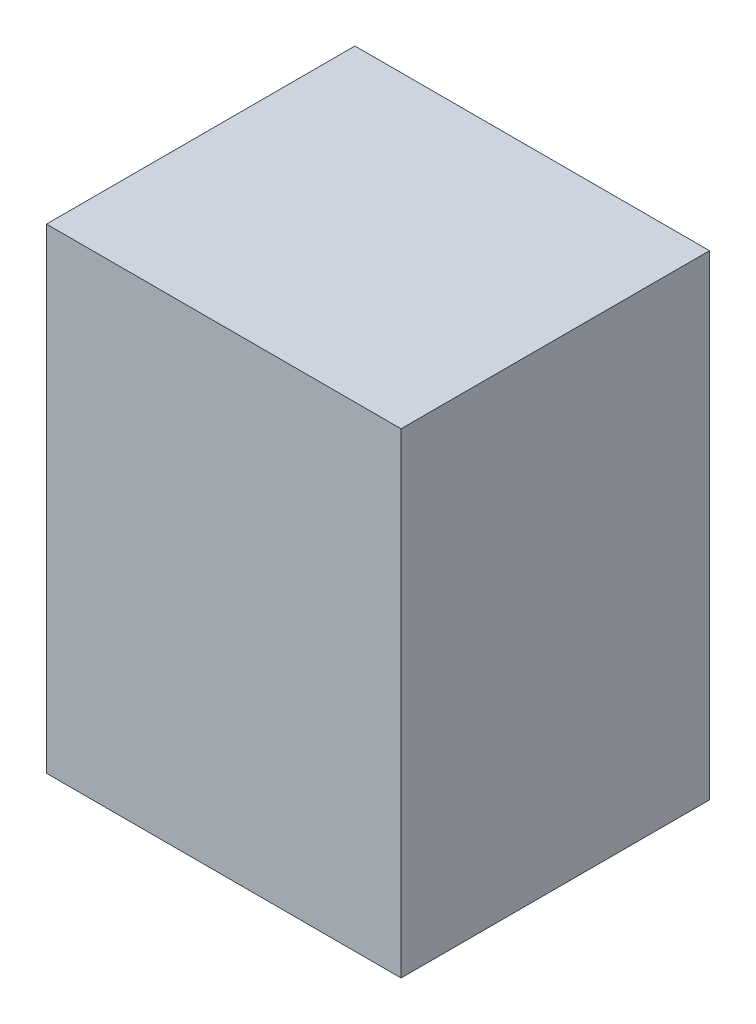
ISO-10303-21;
HEADER;
FILE_DESCRIPTION(('STEP AP214'),'2;1');
FILE_NAME('part.step','',(''),(''),'','','');
FILE_SCHEMA(('AUTOMOTIVE_DESIGN { 1 0 10303 214 1 1 1 1 }'));
ENDSEC;
DATA;
#1=APPLICATION_CONTEXT('core data for automotive mechanical design processes');
#2=APPLICATION_PROTOCOL_DEFINITION('international standard','automotive_design',2000,#1);
#3=PRODUCT_CONTEXT('',#1,'mechanical');
#4=PRODUCT('Part','Part','',(#3));
#5=PRODUCT_RELATED_PRODUCT_CATEGORY('part','',(#4));
#6=PRODUCT_DEFINITION_FORMATION('','',#4);
#7=PRODUCT_DEFINITION_CONTEXT('part definition',#1,'design');
#8=PRODUCT_DEFINITION('design','',#6,#7);
#9=PRODUCT_DEFINITION_SHAPE('','',#8);
#10=(LENGTH_UNIT() NAMED_UNIT(*) SI_UNIT(.MILLI.,.METRE.));
#11=(NAMED_UNIT(*) PLANE_ANGLE_UNIT() SI_UNIT($,.RADIAN.));
#12=(NAMED_UNIT(*) SI_UNIT($,.STERADIAN.) SOLID_ANGLE_UNIT());
#13=UNCERTAINTY_MEASURE_WITH_UNIT(LENGTH_MEASURE(1.E-05),#10,'distance_accuracy_value','');
#14=(GEOMETRIC_REPRESENTATION_CONTEXT(3) GLOBAL_UNCERTAINTY_ASSIGNED_CONTEXT((#13)) GLOBAL_UNIT_ASSIGNED_CONTEXT((#10,
#11,#12)) REPRESENTATION_CONTEXT('',''));
#15=CARTESIAN_POINT('',(0.,0.,0.));
#16=DIRECTION('',(0.,0.,1.));
#17=DIRECTION('',(1.,0.,0.));
#18=AXIS2_PLACEMENT_3D('',#15,#16,#17);
#19=CARTESIAN_POINT('',(-7.8105,-10.4775,13.589));
#20=DIRECTION('',(0.,0.,1.));
#21=DIRECTION('',(1.,0.,0.));
#22=AXIS2_PLACEMENT_3D('',#19,#20,#21);
#23=PLANE('',#22);
#24=DIRECTION('',(1.,0.,0.));
#25=VECTOR('',#24,1.);
#26=CARTESIAN_POINT('',(-7.8105,10.4775,13.589));
#27=LINE('',#26,#25);
#28=CARTESIAN_POINT('',(-7.8105,10.4775,13.589));
#29=VERTEX_POINT('',#28);
#30=CARTESIAN_POINT('',(7.8105,10.4775,13.589));
#31=VERTEX_POINT('',#30);
#32=EDGE_CURVE('E53',#29,#31,#27,.T.);
#33=ORIENTED_EDGE('',*,*,#32,.F.);
#34=DIRECTION('',(0.,1.,0.));
#35=VECTOR('',#34,1.);
#36=CARTESIAN_POINT('',(-7.8105,-10.4775,13.589));
#37=LINE('',#36,#35);
#38=CARTESIAN_POINT('',(-7.8105,-10.4775,13.589));
#39=VERTEX_POINT('',#38);
#40=EDGE_CURVE('E68',#39,#29,#37,.T.);
#41=ORIENTED_EDGE('',*,*,#40,.F.);
#42=DIRECTION('',(1.,0.,0.));
#43=VECTOR('',#42,1.);
#44=CARTESIAN_POINT('',(7.8105,-10.4775,13.589));
#45=LINE('',#44,#43);
#46=CARTESIAN_POINT('',(7.8105,-10.4775,13.589));
#47=VERTEX_POINT('',#46);
#48=EDGE_CURVE('E20',#47,#39,#45,.F.);
#49=ORIENTED_EDGE('',*,*,#48,.F.);
#50=DIRECTION('',(0.,1.,0.));
#51=VECTOR('',#50,1.);
#52=CARTESIAN_POINT('',(7.8105,10.4775,13.589));
#53=LINE('',#52,#51);
#54=EDGE_CURVE('E58',#31,#47,#53,.F.);
#55=ORIENTED_EDGE('',*,*,#54,.F.);
#56=EDGE_LOOP('',(#33,#41,#49,#55));
#57=FACE_BOUND('',#56,.T.);
#58=ADVANCED_FACE('F17',(#57),#23,.T.);
#59=CARTESIAN_POINT('',(7.8105,-10.4775,0.));
#60=DIRECTION('',(0.,-1.,0.));
#61=DIRECTION('',(0.,0.,-1.));
#62=AXIS2_PLACEMENT_3D('',#59,#60,#61);
#63=PLANE('',#62);
#64=DIRECTION('',(0.,0.,1.));
#65=VECTOR('',#64,1.);
#66=CARTESIAN_POINT('',(-7.8105,-10.4775,0.));
#67=LINE('',#66,#65);
#68=CARTESIAN_POINT('',(-7.8105,-10.4775,0.));
#69=VERTEX_POINT('',#68);
#70=EDGE_CURVE('E79',#69,#39,#67,.T.);
#71=ORIENTED_EDGE('',*,*,#70,.F.);
#72=DIRECTION('',(1.,0.,0.));
#73=VECTOR('',#72,1.);
#74=CARTESIAN_POINT('',(-7.8105,-10.4775,0.));
#75=LINE('',#74,#73);
#76=CARTESIAN_POINT('',(7.8105,-10.4775,0.));
#77=VERTEX_POINT('',#76);
#78=EDGE_CURVE('E74',#69,#77,#75,.T.);
#79=ORIENTED_EDGE('',*,*,#78,.T.);
#80=DIRECTION('',(0.,0.,-1.));
#81=VECTOR('',#80,1.);
#82=CARTESIAN_POINT('',(7.8105,-10.4775,0.));
#83=LINE('',#82,#81);
#84=EDGE_CURVE('E63',#47,#77,#83,.T.);
#85=ORIENTED_EDGE('',*,*,#84,.F.);
#86=ORIENTED_EDGE('',*,*,#48,.T.);
#87=EDGE_LOOP('',(#71,#79,#85,#86));
#88=FACE_BOUND('',#87,.T.);
#89=ADVANCED_FACE('F73',(#88),#63,.T.);
#90=CARTESIAN_POINT('',(7.8105,10.4775,0.));
#91=DIRECTION('',(1.,0.,0.));
#92=DIRECTION('',(0.,0.,-1.));
#93=AXIS2_PLACEMENT_3D('',#90,#91,#92);
#94=PLANE('',#93);
#95=ORIENTED_EDGE('',*,*,#84,.T.);
#96=DIRECTION('',(0.,1.,0.));
#97=VECTOR('',#96,1.);
#98=CARTESIAN_POINT('',(7.8105,-10.4775,0.));
#99=LINE('',#98,#97);
#100=CARTESIAN_POINT('',(7.8105,10.4775,0.));
#101=VERTEX_POINT('',#100);
#102=EDGE_CURVE('E84',#77,#101,#99,.T.);
#103=ORIENTED_EDGE('',*,*,#102,.T.);
#104=DIRECTION('',(0.,0.,1.));
#105=VECTOR('',#104,1.);
#106=CARTESIAN_POINT('',(7.8105,10.4775,0.));
#107=LINE('',#106,#105);
#108=EDGE_CURVE('E65',#31,#101,#107,.F.);
#109=ORIENTED_EDGE('',*,*,#108,.F.);
#110=ORIENTED_EDGE('',*,*,#54,.T.);
#111=EDGE_LOOP('',(#95,#103,#109,#110));
#112=FACE_BOUND('',#111,.T.);
#113=ADVANCED_FACE('F60',(#112),#94,.T.);
#114=CARTESIAN_POINT('',(-7.8105,10.4775,0.));
#115=DIRECTION('',(0.,1.,0.));
#116=DIRECTION('',(0.,0.,1.));
#117=AXIS2_PLACEMENT_3D('',#114,#115,#116);
#118=PLANE('',#117);
#119=ORIENTED_EDGE('',*,*,#108,.T.);
#120=DIRECTION('',(1.,0.,0.));
#121=VECTOR('',#120,1.);
#122=CARTESIAN_POINT('',(-7.8105,10.4775,0.));
#123=LINE('',#122,#121);
#124=CARTESIAN_POINT('',(-7.8105,10.4775,0.));
#125=VERTEX_POINT('',#124);
#126=EDGE_CURVE('E26',#101,#125,#123,.F.);
#127=ORIENTED_EDGE('',*,*,#126,.T.);
#128=DIRECTION('',(0.,0.,1.));
#129=VECTOR('',#128,1.);
#130=CARTESIAN_POINT('',(-7.8105,10.4775,0.));
#131=LINE('',#130,#129);
#132=EDGE_CURVE('E34',#29,#125,#131,.F.);
#133=ORIENTED_EDGE('',*,*,#132,.F.);
#134=ORIENTED_EDGE('',*,*,#32,.T.);
#135=EDGE_LOOP('',(#119,#127,#133,#134));
#136=FACE_BOUND('',#135,.T.);
#137=ADVANCED_FACE('F88',(#136),#118,.T.);
#138=CARTESIAN_POINT('',(-7.8105,-10.4775,0.));
#139=DIRECTION('',(-1.,0.,0.));
#140=DIRECTION('',(0.,0.,1.));
#141=AXIS2_PLACEMENT_3D('',#138,#139,#140);
#142=PLANE('',#141);
#143=ORIENTED_EDGE('',*,*,#132,.T.);
#144=DIRECTION('',(0.,1.,0.));
#145=VECTOR('',#144,1.);
#146=CARTESIAN_POINT('',(-7.8105,-10.4775,0.));
#147=LINE('',#146,#145);
#148=EDGE_CURVE('E11',#125,#69,#147,.F.);
#149=ORIENTED_EDGE('',*,*,#148,.T.);
#150=ORIENTED_EDGE('',*,*,#70,.T.);
#151=ORIENTED_EDGE('',*,*,#40,.T.);
#152=EDGE_LOOP('',(#143,#149,#150,#151));
#153=FACE_BOUND('',#152,.T.);
#154=ADVANCED_FACE('F91',(#153),#142,.T.);
#155=CARTESIAN_POINT('',(-7.8105,-10.4775,0.));
#156=DIRECTION('',(0.,0.,1.));
#157=DIRECTION('',(1.,0.,0.));
#158=AXIS2_PLACEMENT_3D('',#155,#156,#157);
#159=PLANE('',#158);
#160=ORIENTED_EDGE('',*,*,#126,.F.);
#161=ORIENTED_EDGE('',*,*,#102,.F.);
#162=ORIENTED_EDGE('',*,*,#78,.F.);
#163=ORIENTED_EDGE('',*,*,#148,.F.);
#164=EDGE_LOOP('',(#160,#161,#162,#163));
#165=FACE_BOUND('',#164,.T.);
#166=ADVANCED_FACE('F90',(#165),#159,.F.);
#167=CLOSED_SHELL('',(#58,#89,#113,#137,#154,#166));
#168=MANIFOLD_SOLID_BREP('B1',#167);
#169=ADVANCED_BREP_SHAPE_REPRESENTATION('',(#18,#168),#14);
#170=SHAPE_DEFINITION_REPRESENTATION(#9,#169);
ENDSEC;
END-ISO-10303-21;
